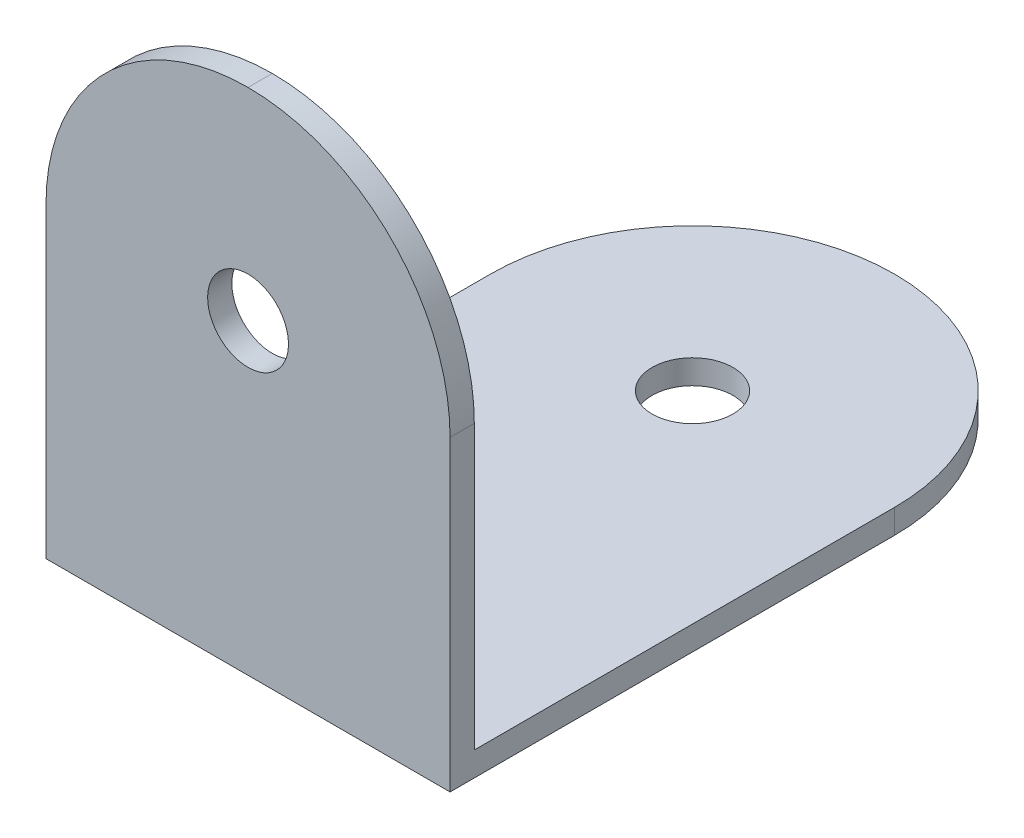
ISO-10303-21;
HEADER;
FILE_DESCRIPTION(('STEP AP214'),'2;1');
FILE_NAME('part.step','',(''),(''),'','','');
FILE_SCHEMA(('AUTOMOTIVE_DESIGN { 1 0 10303 214 1 1 1 1 }'));
ENDSEC;
DATA;
#1=APPLICATION_CONTEXT('core data for automotive mechanical design processes');
#2=APPLICATION_PROTOCOL_DEFINITION('international standard','automotive_design',2000,#1);
#3=PRODUCT_CONTEXT('',#1,'mechanical');
#4=PRODUCT('Part','Part','',(#3));
#5=PRODUCT_RELATED_PRODUCT_CATEGORY('part','',(#4));
#6=PRODUCT_DEFINITION_FORMATION('','',#4);
#7=PRODUCT_DEFINITION_CONTEXT('part definition',#1,'design');
#8=PRODUCT_DEFINITION('design','',#6,#7);
#9=PRODUCT_DEFINITION_SHAPE('','',#8);
#10=(LENGTH_UNIT() NAMED_UNIT(*) SI_UNIT(.MILLI.,.METRE.));
#11=(NAMED_UNIT(*) PLANE_ANGLE_UNIT() SI_UNIT($,.RADIAN.));
#12=(NAMED_UNIT(*) SI_UNIT($,.STERADIAN.) SOLID_ANGLE_UNIT());
#13=UNCERTAINTY_MEASURE_WITH_UNIT(LENGTH_MEASURE(1.E-05),#10,'distance_accuracy_value','');
#14=(GEOMETRIC_REPRESENTATION_CONTEXT(3) GLOBAL_UNCERTAINTY_ASSIGNED_CONTEXT((#13)) GLOBAL_UNIT_ASSIGNED_CONTEXT((#10,
#11,#12)) REPRESENTATION_CONTEXT('',''));
#15=CARTESIAN_POINT('',(0.,0.,0.));
#16=DIRECTION('',(0.,0.,1.));
#17=DIRECTION('',(1.,0.,0.));
#18=AXIS2_PLACEMENT_3D('',#15,#16,#17);
#19=CARTESIAN_POINT('',(0.,0.,0.));
#20=DIRECTION('',(0.,1.,0.));
#21=DIRECTION('',(0.,0.,1.));
#22=AXIS2_PLACEMENT_3D('',#19,#20,#21);
#23=PLANE('',#22);
#24=CARTESIAN_POINT('',(0.,0.,-7.5));
#25=DIRECTION('',(0.,1.,0.));
#26=DIRECTION('',(0.,0.,1.));
#27=AXIS2_PLACEMENT_3D('',#24,#25,#26);
#28=CIRCLE('',#27,2.5);
#29=CARTESIAN_POINT('',(0.,0.,-5.));
#30=VERTEX_POINT('',#29);
#31=EDGE_CURVE('E162',#30,#30,#28,.T.);
#32=ORIENTED_EDGE('',*,*,#31,.F.);
#33=EDGE_LOOP('',(#32));
#34=FACE_BOUND('',#33,.T.);
#35=CARTESIAN_POINT('',(0.,0.,-7.5));
#36=DIRECTION('',(0.,1.,0.));
#37=DIRECTION('',(0.,0.,1.));
#38=AXIS2_PLACEMENT_3D('',#35,#36,#37);
#39=CIRCLE('',#38,12.5);
#40=CARTESIAN_POINT('',(12.5,0.,-7.5));
#41=VERTEX_POINT('',#40);
#42=CARTESIAN_POINT('',(0.,0.,-20.));
#43=VERTEX_POINT('',#42);
#44=EDGE_CURVE('E58',#41,#43,#39,.T.);
#45=ORIENTED_EDGE('',*,*,#44,.T.);
#46=CARTESIAN_POINT('',(0.,0.,-7.5));
#47=DIRECTION('',(0.,1.,0.));
#48=DIRECTION('',(0.,0.,1.));
#49=AXIS2_PLACEMENT_3D('',#46,#47,#48);
#50=CIRCLE('',#49,12.5);
#51=CARTESIAN_POINT('',(-12.5,0.,-7.5));
#52=VERTEX_POINT('',#51);
#53=EDGE_CURVE('E123',#43,#52,#50,.T.);
#54=ORIENTED_EDGE('',*,*,#53,.T.);
#55=DIRECTION('',(0.,0.,-1.));
#56=VECTOR('',#55,1.);
#57=CARTESIAN_POINT('',(-12.5,0.,0.));
#58=LINE('',#57,#56);
#59=CARTESIAN_POINT('',(-12.5,0.,18.5));
#60=VERTEX_POINT('',#59);
#61=EDGE_CURVE('E108',#60,#52,#58,.T.);
#62=ORIENTED_EDGE('',*,*,#61,.F.);
#63=DIRECTION('',(1.,0.,0.));
#64=VECTOR('',#63,1.);
#65=CARTESIAN_POINT('',(0.,0.,18.5));
#66=LINE('',#65,#64);
#67=CARTESIAN_POINT('',(12.5,0.,18.5));
#68=VERTEX_POINT('',#67);
#69=EDGE_CURVE('E114',#60,#68,#66,.T.);
#70=ORIENTED_EDGE('',*,*,#69,.T.);
#71=DIRECTION('',(0.,0.,-1.));
#72=VECTOR('',#71,1.);
#73=CARTESIAN_POINT('',(12.5,0.,0.));
#74=LINE('',#73,#72);
#75=EDGE_CURVE('E124',#68,#41,#74,.T.);
#76=ORIENTED_EDGE('',*,*,#75,.T.);
#77=EDGE_LOOP('',(#45,#54,#62,#70,#76));
#78=FACE_BOUND('',#77,.T.);
#79=ADVANCED_FACE('F35',(#34,#78),#23,.T.);
#80=CARTESIAN_POINT('',(-12.5,-1.5,0.));
#81=DIRECTION('',(1.,0.,0.));
#82=DIRECTION('',(0.,0.,-1.));
#83=AXIS2_PLACEMENT_3D('',#80,#81,#82);
#84=PLANE('',#83);
#85=DIRECTION('',(0.,1.,0.));
#86=VECTOR('',#85,1.);
#87=CARTESIAN_POINT('',(-12.5,-1.5,20.));
#88=LINE('',#87,#86);
#89=CARTESIAN_POINT('',(-12.5,-1.5,20.));
#90=VERTEX_POINT('',#89);
#91=CARTESIAN_POINT('',(-12.5,17.5,20.));
#92=VERTEX_POINT('',#91);
#93=EDGE_CURVE('E137',#90,#92,#88,.T.);
#94=ORIENTED_EDGE('',*,*,#93,.T.);
#95=DIRECTION('',(0.,0.,-1.));
#96=VECTOR('',#95,1.);
#97=CARTESIAN_POINT('',(-12.5,17.5,18.5));
#98=LINE('',#97,#96);
#99=CARTESIAN_POINT('',(-12.5,17.5,18.5));
#100=VERTEX_POINT('',#99);
#101=EDGE_CURVE('E111',#92,#100,#98,.T.);
#102=ORIENTED_EDGE('',*,*,#101,.T.);
#103=DIRECTION('',(0.,-1.,0.));
#104=VECTOR('',#103,1.);
#105=CARTESIAN_POINT('',(-12.5,30.,18.5));
#106=LINE('',#105,#104);
#107=EDGE_CURVE('E102',#100,#60,#106,.T.);
#108=ORIENTED_EDGE('',*,*,#107,.T.);
#109=ORIENTED_EDGE('',*,*,#61,.T.);
#110=DIRECTION('',(0.,1.,0.));
#111=VECTOR('',#110,1.);
#112=CARTESIAN_POINT('',(-12.5,-1.5,-7.5));
#113=LINE('',#112,#111);
#114=CARTESIAN_POINT('',(-12.5,-1.5,-7.5));
#115=VERTEX_POINT('',#114);
#116=EDGE_CURVE('E136',#52,#115,#113,.F.);
#117=ORIENTED_EDGE('',*,*,#116,.T.);
#118=DIRECTION('',(0.,0.,-1.));
#119=VECTOR('',#118,1.);
#120=CARTESIAN_POINT('',(-12.5,-1.5,0.));
#121=LINE('',#120,#119);
#122=EDGE_CURVE('E126',#90,#115,#121,.T.);
#123=ORIENTED_EDGE('',*,*,#122,.F.);
#124=EDGE_LOOP('',(#94,#102,#108,#109,#117,#123));
#125=FACE_BOUND('',#124,.T.);
#126=ADVANCED_FACE('F105',(#125),#84,.F.);
#127=CARTESIAN_POINT('',(12.5,-1.5,0.));
#128=DIRECTION('',(1.,0.,0.));
#129=DIRECTION('',(0.,0.,-1.));
#130=AXIS2_PLACEMENT_3D('',#127,#128,#129);
#131=PLANE('',#130);
#132=DIRECTION('',(0.,-1.,0.));
#133=VECTOR('',#132,1.);
#134=CARTESIAN_POINT('',(12.5,30.,18.5));
#135=LINE('',#134,#133);
#136=CARTESIAN_POINT('',(12.5,17.5,18.5));
#137=VERTEX_POINT('',#136);
#138=EDGE_CURVE('E113',#137,#68,#135,.T.);
#139=ORIENTED_EDGE('',*,*,#138,.F.);
#140=DIRECTION('',(0.,0.,-1.));
#141=VECTOR('',#140,1.);
#142=CARTESIAN_POINT('',(12.5,17.5,0.));
#143=LINE('',#142,#141);
#144=CARTESIAN_POINT('',(12.5,17.5,20.));
#145=VERTEX_POINT('',#144);
#146=EDGE_CURVE('E151',#137,#145,#143,.F.);
#147=ORIENTED_EDGE('',*,*,#146,.T.);
#148=DIRECTION('',(0.,1.,0.));
#149=VECTOR('',#148,1.);
#150=CARTESIAN_POINT('',(12.5,-1.5,20.));
#151=LINE('',#150,#149);
#152=CARTESIAN_POINT('',(12.5,-1.5,20.));
#153=VERTEX_POINT('',#152);
#154=EDGE_CURVE('E133',#153,#145,#151,.T.);
#155=ORIENTED_EDGE('',*,*,#154,.F.);
#156=DIRECTION('',(0.,0.,-1.));
#157=VECTOR('',#156,1.);
#158=CARTESIAN_POINT('',(12.5,-1.5,0.));
#159=LINE('',#158,#157);
#160=CARTESIAN_POINT('',(12.5,-1.5,-7.5));
#161=VERTEX_POINT('',#160);
#162=EDGE_CURVE('E130',#153,#161,#159,.T.);
#163=ORIENTED_EDGE('',*,*,#162,.T.);
#164=DIRECTION('',(0.,1.,0.));
#165=VECTOR('',#164,1.);
#166=CARTESIAN_POINT('',(12.5,-1.5,-7.5));
#167=LINE('',#166,#165);
#168=EDGE_CURVE('E149',#161,#41,#167,.T.);
#169=ORIENTED_EDGE('',*,*,#168,.T.);
#170=ORIENTED_EDGE('',*,*,#75,.F.);
#171=EDGE_LOOP('',(#139,#147,#155,#163,#169,#170));
#172=FACE_BOUND('',#171,.T.);
#173=ADVANCED_FACE('F178',(#172),#131,.T.);
#174=CARTESIAN_POINT('',(0.,-1.5,20.));
#175=DIRECTION('',(0.,0.,-1.));
#176=DIRECTION('',(-1.,0.,0.));
#177=AXIS2_PLACEMENT_3D('',#174,#175,#176);
#178=PLANE('',#177);
#179=CARTESIAN_POINT('',(0.,17.5,20.));
#180=DIRECTION('',(0.,0.,-1.));
#181=DIRECTION('',(-1.,0.,0.));
#182=AXIS2_PLACEMENT_3D('',#179,#180,#181);
#183=CIRCLE('',#182,2.5);
#184=CARTESIAN_POINT('',(-2.5,17.5,20.));
#185=VERTEX_POINT('',#184);
#186=EDGE_CURVE('E169',#185,#185,#183,.T.);
#187=ORIENTED_EDGE('',*,*,#186,.T.);
#188=EDGE_LOOP('',(#187));
#189=FACE_BOUND('',#188,.T.);
#190=CARTESIAN_POINT('',(0.,17.5,20.));
#191=DIRECTION('',(0.,0.,-1.));
#192=DIRECTION('',(-1.,0.,0.));
#193=AXIS2_PLACEMENT_3D('',#190,#191,#192);
#194=CIRCLE('',#193,12.5);
#195=CARTESIAN_POINT('',(0.,30.,20.));
#196=VERTEX_POINT('',#195);
#197=EDGE_CURVE('E145',#145,#196,#194,.F.);
#198=ORIENTED_EDGE('',*,*,#197,.T.);
#199=CARTESIAN_POINT('',(0.,17.5,20.));
#200=DIRECTION('',(0.,0.,-1.));
#201=DIRECTION('',(-1.,0.,0.));
#202=AXIS2_PLACEMENT_3D('',#199,#200,#201);
#203=CIRCLE('',#202,12.5);
#204=EDGE_CURVE('E147',#196,#92,#203,.F.);
#205=ORIENTED_EDGE('',*,*,#204,.T.);
#206=ORIENTED_EDGE('',*,*,#93,.F.);
#207=DIRECTION('',(-1.,0.,0.));
#208=VECTOR('',#207,1.);
#209=CARTESIAN_POINT('',(0.,-1.5,20.));
#210=LINE('',#209,#208);
#211=EDGE_CURVE('E171',#153,#90,#210,.T.);
#212=ORIENTED_EDGE('',*,*,#211,.F.);
#213=ORIENTED_EDGE('',*,*,#154,.T.);
#214=EDGE_LOOP('',(#198,#205,#206,#212,#213));
#215=FACE_BOUND('',#214,.T.);
#216=ADVANCED_FACE('F184',(#189,#215),#178,.F.);
#217=CARTESIAN_POINT('',(0.,-1.5,0.));
#218=DIRECTION('',(0.,1.,0.));
#219=DIRECTION('',(0.,0.,1.));
#220=AXIS2_PLACEMENT_3D('',#217,#218,#219);
#221=PLANE('',#220);
#222=CARTESIAN_POINT('',(0.,-1.5,-7.5));
#223=DIRECTION('',(0.,1.,0.));
#224=DIRECTION('',(0.,0.,1.));
#225=AXIS2_PLACEMENT_3D('',#222,#223,#224);
#226=CIRCLE('',#225,2.5);
#227=CARTESIAN_POINT('',(0.,-1.5,-5.));
#228=VERTEX_POINT('',#227);
#229=EDGE_CURVE('E159',#228,#228,#226,.T.);
#230=ORIENTED_EDGE('',*,*,#229,.T.);
#231=EDGE_LOOP('',(#230));
#232=FACE_BOUND('',#231,.T.);
#233=ORIENTED_EDGE('',*,*,#122,.T.);
#234=CARTESIAN_POINT('',(0.,-1.5,-7.5));
#235=DIRECTION('',(0.,1.,0.));
#236=DIRECTION('',(0.,0.,1.));
#237=AXIS2_PLACEMENT_3D('',#234,#235,#236);
#238=CIRCLE('',#237,12.5);
#239=CARTESIAN_POINT('',(0.,-1.5,-20.));
#240=VERTEX_POINT('',#239);
#241=EDGE_CURVE('E11',#115,#240,#238,.F.);
#242=ORIENTED_EDGE('',*,*,#241,.T.);
#243=CARTESIAN_POINT('',(0.,-1.5,-7.5));
#244=DIRECTION('',(0.,1.,0.));
#245=DIRECTION('',(0.,0.,1.));
#246=AXIS2_PLACEMENT_3D('',#243,#244,#245);
#247=CIRCLE('',#246,12.5);
#248=EDGE_CURVE('E44',#240,#161,#247,.F.);
#249=ORIENTED_EDGE('',*,*,#248,.T.);
#250=ORIENTED_EDGE('',*,*,#162,.F.);
#251=ORIENTED_EDGE('',*,*,#211,.T.);
#252=EDGE_LOOP('',(#233,#242,#249,#250,#251));
#253=FACE_BOUND('',#252,.T.);
#254=ADVANCED_FACE('F182',(#232,#253),#221,.F.);
#255=CARTESIAN_POINT('',(0.,30.,18.5));
#256=DIRECTION('',(0.,0.,-1.));
#257=DIRECTION('',(-1.,0.,0.));
#258=AXIS2_PLACEMENT_3D('',#255,#256,#257);
#259=PLANE('',#258);
#260=CARTESIAN_POINT('',(0.,17.5,18.5));
#261=DIRECTION('',(0.,0.,-1.));
#262=DIRECTION('',(-1.,0.,0.));
#263=AXIS2_PLACEMENT_3D('',#260,#261,#262);
#264=CIRCLE('',#263,2.5);
#265=CARTESIAN_POINT('',(-2.5,17.5,18.5));
#266=VERTEX_POINT('',#265);
#267=EDGE_CURVE('E39',#266,#266,#264,.T.);
#268=ORIENTED_EDGE('',*,*,#267,.F.);
#269=EDGE_LOOP('',(#268));
#270=FACE_BOUND('',#269,.T.);
#271=ORIENTED_EDGE('',*,*,#107,.F.);
#272=CARTESIAN_POINT('',(0.,17.5,18.5));
#273=DIRECTION('',(0.,0.,-1.));
#274=DIRECTION('',(-1.,0.,0.));
#275=AXIS2_PLACEMENT_3D('',#272,#273,#274);
#276=CIRCLE('',#275,12.5);
#277=CARTESIAN_POINT('',(0.,30.,18.5));
#278=VERTEX_POINT('',#277);
#279=EDGE_CURVE('E143',#100,#278,#276,.T.);
#280=ORIENTED_EDGE('',*,*,#279,.T.);
#281=CARTESIAN_POINT('',(0.,17.5,18.5));
#282=DIRECTION('',(0.,0.,-1.));
#283=DIRECTION('',(-1.,0.,0.));
#284=AXIS2_PLACEMENT_3D('',#281,#282,#283);
#285=CIRCLE('',#284,12.5);
#286=EDGE_CURVE('E141',#278,#137,#285,.T.);
#287=ORIENTED_EDGE('',*,*,#286,.T.);
#288=ORIENTED_EDGE('',*,*,#138,.T.);
#289=ORIENTED_EDGE('',*,*,#69,.F.);
#290=EDGE_LOOP('',(#271,#280,#287,#288,#289));
#291=FACE_BOUND('',#290,.T.);
#292=ADVANCED_FACE('F117',(#270,#291),#259,.T.);
#293=CARTESIAN_POINT('',(0.,17.5,0.));
#294=DIRECTION('',(0.,0.,-1.));
#295=DIRECTION('',(-1.,0.,0.));
#296=AXIS2_PLACEMENT_3D('',#293,#294,#295);
#297=CYLINDRICAL_SURFACE('',#296,12.5);
#298=DIRECTION('',(0.,0.,-1.));
#299=VECTOR('',#298,1.);
#300=CARTESIAN_POINT('',(0.,30.,0.));
#301=LINE('',#300,#299);
#302=EDGE_CURVE('E120',#196,#278,#301,.T.);
#303=ORIENTED_EDGE('',*,*,#302,.F.);
#304=ORIENTED_EDGE('',*,*,#197,.F.);
#305=ORIENTED_EDGE('',*,*,#146,.F.);
#306=ORIENTED_EDGE('',*,*,#286,.F.);
#307=EDGE_LOOP('',(#303,#304,#305,#306));
#308=FACE_BOUND('',#307,.T.);
#309=ADVANCED_FACE('F190',(#308),#297,.T.);
#310=CARTESIAN_POINT('',(0.,17.5,0.));
#311=DIRECTION('',(0.,0.,1.));
#312=DIRECTION('',(1.,0.,0.));
#313=AXIS2_PLACEMENT_3D('',#310,#311,#312);
#314=CYLINDRICAL_SURFACE('',#313,12.5);
#315=ORIENTED_EDGE('',*,*,#204,.F.);
#316=ORIENTED_EDGE('',*,*,#302,.T.);
#317=ORIENTED_EDGE('',*,*,#279,.F.);
#318=ORIENTED_EDGE('',*,*,#101,.F.);
#319=EDGE_LOOP('',(#315,#316,#317,#318));
#320=FACE_BOUND('',#319,.T.);
#321=ADVANCED_FACE('F206',(#320),#314,.T.);
#322=CARTESIAN_POINT('',(0.,-1.5,-7.5));
#323=DIRECTION('',(0.,1.,0.));
#324=DIRECTION('',(0.,0.,1.));
#325=AXIS2_PLACEMENT_3D('',#322,#323,#324);
#326=CYLINDRICAL_SURFACE('',#325,12.5);
#327=ORIENTED_EDGE('',*,*,#168,.F.);
#328=ORIENTED_EDGE('',*,*,#248,.F.);
#329=DIRECTION('',(0.,1.,0.));
#330=VECTOR('',#329,1.);
#331=CARTESIAN_POINT('',(0.,-1.5,-20.));
#332=LINE('',#331,#330);
#333=EDGE_CURVE('E157',#43,#240,#332,.F.);
#334=ORIENTED_EDGE('',*,*,#333,.F.);
#335=ORIENTED_EDGE('',*,*,#44,.F.);
#336=EDGE_LOOP('',(#327,#328,#334,#335));
#337=FACE_BOUND('',#336,.T.);
#338=ADVANCED_FACE('F37',(#337),#326,.T.);
#339=CARTESIAN_POINT('',(0.,-1.5,-7.5));
#340=DIRECTION('',(0.,-1.,0.));
#341=DIRECTION('',(0.,0.,-1.));
#342=AXIS2_PLACEMENT_3D('',#339,#340,#341);
#343=CYLINDRICAL_SURFACE('',#342,12.5);
#344=ORIENTED_EDGE('',*,*,#241,.F.);
#345=ORIENTED_EDGE('',*,*,#116,.F.);
#346=ORIENTED_EDGE('',*,*,#53,.F.);
#347=ORIENTED_EDGE('',*,*,#333,.T.);
#348=EDGE_LOOP('',(#344,#345,#346,#347));
#349=FACE_BOUND('',#348,.T.);
#350=ADVANCED_FACE('F180',(#349),#343,.T.);
#351=CARTESIAN_POINT('',(0.,-1.5,-7.5));
#352=DIRECTION('',(0.,1.,0.));
#353=DIRECTION('',(0.,0.,1.));
#354=AXIS2_PLACEMENT_3D('',#351,#352,#353);
#355=CYLINDRICAL_SURFACE('',#354,2.5);
#356=ORIENTED_EDGE('',*,*,#229,.F.);
#357=EDGE_LOOP('',(#356));
#358=FACE_BOUND('',#357,.T.);
#359=ORIENTED_EDGE('',*,*,#31,.T.);
#360=EDGE_LOOP('',(#359));
#361=FACE_BOUND('',#360,.T.);
#362=ADVANCED_FACE('F213',(#358,#361),#355,.F.);
#363=CARTESIAN_POINT('',(0.,17.5,20.));
#364=DIRECTION('',(0.,0.,-1.));
#365=DIRECTION('',(-1.,0.,0.));
#366=AXIS2_PLACEMENT_3D('',#363,#364,#365);
#367=CYLINDRICAL_SURFACE('',#366,2.5);
#368=ORIENTED_EDGE('',*,*,#267,.T.);
#369=EDGE_LOOP('',(#368));
#370=FACE_BOUND('',#369,.T.);
#371=ORIENTED_EDGE('',*,*,#186,.F.);
#372=EDGE_LOOP('',(#371));
#373=FACE_BOUND('',#372,.T.);
#374=ADVANCED_FACE('F218',(#370,#373),#367,.F.);
#375=CLOSED_SHELL('',(#79,#126,#173,#216,#254,#292,#309,#321,#338,#350,#362,#374));
#376=MANIFOLD_SOLID_BREP('B2',#375);
#377=ADVANCED_BREP_SHAPE_REPRESENTATION('',(#18,#376),#14);
#378=SHAPE_DEFINITION_REPRESENTATION(#9,#377);
ENDSEC;
END-ISO-10303-21;
